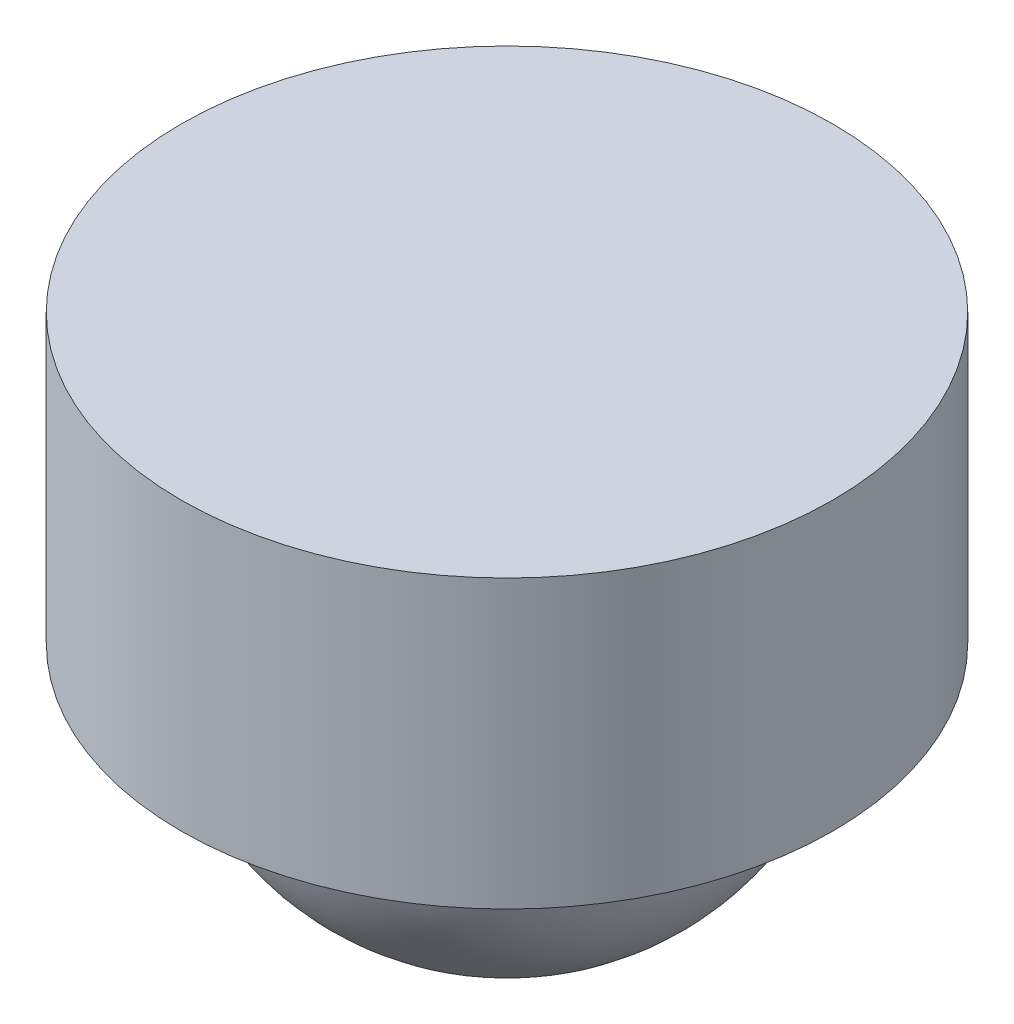
ISO-10303-21;
HEADER;
FILE_DESCRIPTION(('STEP AP214'),'2;1');
FILE_NAME('part.step','',(''),(''),'','','');
FILE_SCHEMA(('AUTOMOTIVE_DESIGN { 1 0 10303 214 1 1 1 1 }'));
ENDSEC;
DATA;
#1=APPLICATION_CONTEXT('core data for automotive mechanical design processes');
#2=APPLICATION_PROTOCOL_DEFINITION('international standard','automotive_design',2000,#1);
#3=PRODUCT_CONTEXT('',#1,'mechanical');
#4=PRODUCT('Part','Part','',(#3));
#5=PRODUCT_RELATED_PRODUCT_CATEGORY('part','',(#4));
#6=PRODUCT_DEFINITION_FORMATION('','',#4);
#7=PRODUCT_DEFINITION_CONTEXT('part definition',#1,'design');
#8=PRODUCT_DEFINITION('design','',#6,#7);
#9=PRODUCT_DEFINITION_SHAPE('','',#8);
#10=(LENGTH_UNIT() NAMED_UNIT(*) SI_UNIT(.MILLI.,.METRE.));
#11=(NAMED_UNIT(*) PLANE_ANGLE_UNIT() SI_UNIT($,.RADIAN.));
#12=(NAMED_UNIT(*) SI_UNIT($,.STERADIAN.) SOLID_ANGLE_UNIT());
#13=UNCERTAINTY_MEASURE_WITH_UNIT(LENGTH_MEASURE(1.E-05),#10,'distance_accuracy_value','');
#14=(GEOMETRIC_REPRESENTATION_CONTEXT(3) GLOBAL_UNCERTAINTY_ASSIGNED_CONTEXT((#13)) GLOBAL_UNIT_ASSIGNED_CONTEXT((#10,
#11,#12)) REPRESENTATION_CONTEXT('',''));
#15=CARTESIAN_POINT('',(0.,0.,0.));
#16=DIRECTION('',(0.,0.,1.));
#17=DIRECTION('',(1.,0.,0.));
#18=AXIS2_PLACEMENT_3D('',#15,#16,#17);
#19=CARTESIAN_POINT('',(0.,20.,0.));
#20=DIRECTION('',(0.,-1.,0.));
#21=DIRECTION('',(0.,0.,-1.));
#22=AXIS2_PLACEMENT_3D('',#19,#20,#21);
#23=CYLINDRICAL_SURFACE('',#22,12.5);
#24=CARTESIAN_POINT('',(0.,20.,0.));
#25=DIRECTION('',(0.,1.,0.));
#26=DIRECTION('',(0.,0.,1.));
#27=AXIS2_PLACEMENT_3D('',#24,#25,#26);
#28=CIRCLE('',#27,12.5);
#29=CARTESIAN_POINT('',(0.,20.,12.5));
#30=VERTEX_POINT('',#29);
#31=EDGE_CURVE('E11',#30,#30,#28,.T.);
#32=ORIENTED_EDGE('',*,*,#31,.F.);
#33=EDGE_LOOP('',(#32));
#34=FACE_BOUND('',#33,.T.);
#35=CARTESIAN_POINT('',(0.,9.,0.));
#36=DIRECTION('',(0.,1.,0.));
#37=DIRECTION('',(0.,0.,1.));
#38=AXIS2_PLACEMENT_3D('',#35,#36,#37);
#39=CIRCLE('',#38,12.5);
#40=CARTESIAN_POINT('',(0.,9.,12.5));
#41=VERTEX_POINT('',#40);
#42=EDGE_CURVE('E44',#41,#41,#39,.T.);
#43=ORIENTED_EDGE('',*,*,#42,.T.);
#44=EDGE_LOOP('',(#43));
#45=FACE_BOUND('',#44,.T.);
#46=ADVANCED_FACE('F41',(#34,#45),#23,.T.);
#47=CARTESIAN_POINT('',(0.,20.,0.));
#48=DIRECTION('',(0.,1.,0.));
#49=DIRECTION('',(0.,0.,1.));
#50=AXIS2_PLACEMENT_3D('',#47,#48,#49);
#51=PLANE('',#50);
#52=ORIENTED_EDGE('',*,*,#31,.T.);
#53=EDGE_LOOP('',(#52));
#54=FACE_BOUND('',#53,.T.);
#55=ADVANCED_FACE('F56',(#54),#51,.T.);
#56=CARTESIAN_POINT('',(0.,9.,0.));
#57=DIRECTION('',(0.,1.,0.));
#58=DIRECTION('',(0.,0.,1.));
#59=AXIS2_PLACEMENT_3D('',#56,#57,#58);
#60=PLANE('',#59);
#61=ORIENTED_EDGE('',*,*,#42,.F.);
#62=EDGE_LOOP('',(#61));
#63=FACE_BOUND('',#62,.T.);
#64=ADVANCED_FACE('F54',(#63),#60,.F.);
#65=CLOSED_SHELL('',(#46,#55,#64));
#66=MANIFOLD_SOLID_BREP('B2',#65);
#67=CARTESIAN_POINT('',(0.,9.5,0.));
#68=DIRECTION('',(0.,-1.,0.));
#69=DIRECTION('',(-1.,0.,0.));
#70=AXIS2_PLACEMENT_3D('',#67,#68,#69);
#71=SPHERICAL_SURFACE('',#70,9.5);
#72=CARTESIAN_POINT('',(0.,0.,0.));
#73=VERTEX_POINT('',#72);
#74=VERTEX_LOOP('',#73);
#75=FACE_BOUND('',#74,.T.);
#76=ADVANCED_FACE('F84',(#75),#71,.T.);
#77=CLOSED_SHELL('',(#76));
#78=MANIFOLD_SOLID_BREP('B6',#77);
#79=ADVANCED_BREP_SHAPE_REPRESENTATION('',(#18,#66,#78),#14);
#80=SHAPE_DEFINITION_REPRESENTATION(#9,#79);
ENDSEC;
END-ISO-10303-21;
